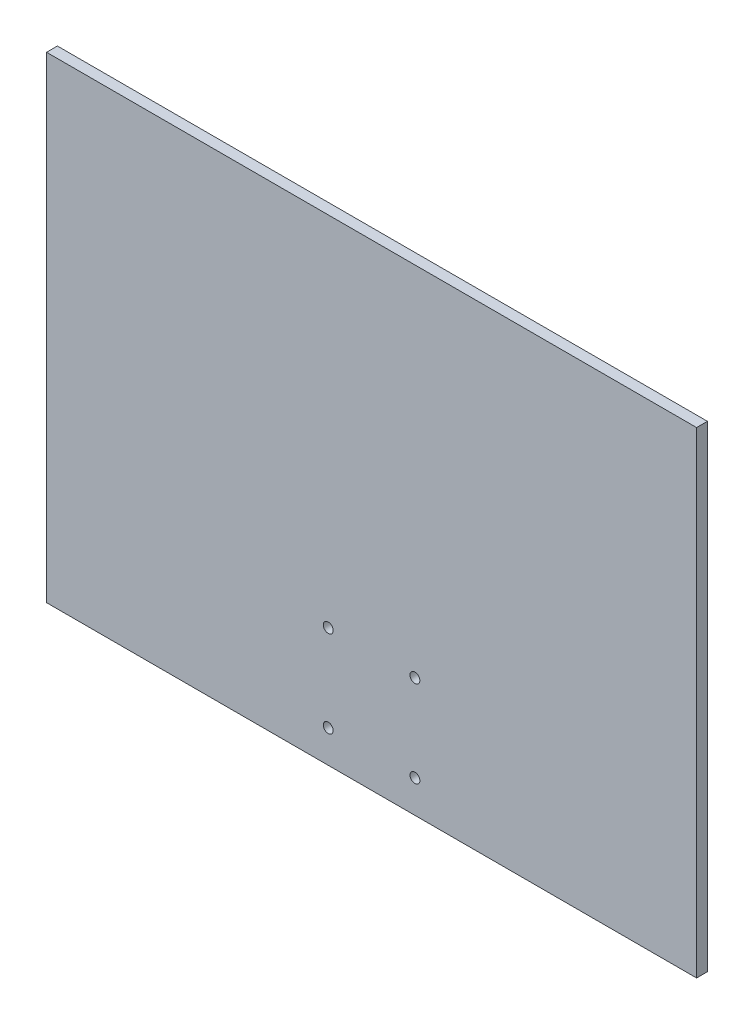
ISO-10303-21;
HEADER;
FILE_DESCRIPTION(('STEP AP214'),'2;1');
FILE_NAME('part.step','',(''),(''),'','','');
FILE_SCHEMA(('AUTOMOTIVE_DESIGN { 1 0 10303 214 1 1 1 1 }'));
ENDSEC;
DATA;
#1=APPLICATION_CONTEXT('core data for automotive mechanical design processes');
#2=APPLICATION_PROTOCOL_DEFINITION('international standard','automotive_design',2000,#1);
#3=PRODUCT_CONTEXT('',#1,'mechanical');
#4=PRODUCT('Part','Part','',(#3));
#5=PRODUCT_RELATED_PRODUCT_CATEGORY('part','',(#4));
#6=PRODUCT_DEFINITION_FORMATION('','',#4);
#7=PRODUCT_DEFINITION_CONTEXT('part definition',#1,'design');
#8=PRODUCT_DEFINITION('design','',#6,#7);
#9=PRODUCT_DEFINITION_SHAPE('','',#8);
#10=(LENGTH_UNIT() NAMED_UNIT(*) SI_UNIT(.MILLI.,.METRE.));
#11=(NAMED_UNIT(*) PLANE_ANGLE_UNIT() SI_UNIT($,.RADIAN.));
#12=(NAMED_UNIT(*) SI_UNIT($,.STERADIAN.) SOLID_ANGLE_UNIT());
#13=UNCERTAINTY_MEASURE_WITH_UNIT(LENGTH_MEASURE(1.E-05),#10,'distance_accuracy_value','');
#14=(GEOMETRIC_REPRESENTATION_CONTEXT(3) GLOBAL_UNCERTAINTY_ASSIGNED_CONTEXT((#13)) GLOBAL_UNIT_ASSIGNED_CONTEXT((#10,
#11,#12)) REPRESENTATION_CONTEXT('',''));
#15=CARTESIAN_POINT('',(0.,0.,0.));
#16=DIRECTION('',(0.,0.,1.));
#17=DIRECTION('',(1.,0.,0.));
#18=AXIS2_PLACEMENT_3D('',#15,#16,#17);
#19=CARTESIAN_POINT('',(0.,0.,0.));
#20=DIRECTION('',(0.,0.,-1.));
#21=DIRECTION('',(-1.,0.,0.));
#22=AXIS2_PLACEMENT_3D('',#19,#20,#21);
#23=PLANE('',#22);
#24=CARTESIAN_POINT('',(-25.4,-69.85,0.));
#25=DIRECTION('',(0.,0.,1.));
#26=DIRECTION('',(1.,0.,0.));
#27=AXIS2_PLACEMENT_3D('',#24,#25,#26);
#28=CIRCLE('',#27,2.9);
#29=CARTESIAN_POINT('',(-22.5,-69.85,0.));
#30=VERTEX_POINT('',#29);
#31=EDGE_CURVE('E158',#30,#30,#28,.T.);
#32=ORIENTED_EDGE('',*,*,#31,.T.);
#33=EDGE_LOOP('',(#32));
#34=FACE_BOUND('',#33,.T.);
#35=DIRECTION('',(0.,1.,0.));
#36=VECTOR('',#35,1.);
#37=CARTESIAN_POINT('',(190.5,-139.7,0.));
#38=LINE('',#37,#36);
#39=CARTESIAN_POINT('',(190.5,-139.7,0.));
#40=VERTEX_POINT('',#39);
#41=CARTESIAN_POINT('',(190.5,139.7,0.));
#42=VERTEX_POINT('',#41);
#43=EDGE_CURVE('E114',#40,#42,#38,.T.);
#44=ORIENTED_EDGE('',*,*,#43,.F.);
#45=DIRECTION('',(1.,0.,0.));
#46=VECTOR('',#45,1.);
#47=CARTESIAN_POINT('',(-190.5,-139.7,0.));
#48=LINE('',#47,#46);
#49=CARTESIAN_POINT('',(-190.5,-139.7,0.));
#50=VERTEX_POINT('',#49);
#51=EDGE_CURVE('E86',#50,#40,#48,.T.);
#52=ORIENTED_EDGE('',*,*,#51,.F.);
#53=DIRECTION('',(0.,-1.,0.));
#54=VECTOR('',#53,1.);
#55=CARTESIAN_POINT('',(-190.5,-139.7,0.));
#56=LINE('',#55,#54);
#57=CARTESIAN_POINT('',(-190.5,139.7,0.));
#58=VERTEX_POINT('',#57);
#59=EDGE_CURVE('E80',#58,#50,#56,.T.);
#60=ORIENTED_EDGE('',*,*,#59,.F.);
#61=DIRECTION('',(-1.,0.,0.));
#62=VECTOR('',#61,1.);
#63=CARTESIAN_POINT('',(-190.5,139.7,0.));
#64=LINE('',#63,#62);
#65=EDGE_CURVE('E103',#42,#58,#64,.T.);
#66=ORIENTED_EDGE('',*,*,#65,.F.);
#67=EDGE_LOOP('',(#44,#52,#60,#66));
#68=FACE_BOUND('',#67,.T.);
#69=CARTESIAN_POINT('',(-25.4,-120.65,0.));
#70=DIRECTION('',(0.,0.,1.));
#71=DIRECTION('',(1.,0.,0.));
#72=AXIS2_PLACEMENT_3D('',#69,#70,#71);
#73=CIRCLE('',#72,2.9);
#74=CARTESIAN_POINT('',(-22.5,-120.65,0.));
#75=VERTEX_POINT('',#74);
#76=EDGE_CURVE('E118',#75,#75,#73,.T.);
#77=ORIENTED_EDGE('',*,*,#76,.T.);
#78=EDGE_LOOP('',(#77));
#79=FACE_BOUND('',#78,.T.);
#80=CARTESIAN_POINT('',(25.4,-69.85,0.));
#81=DIRECTION('',(0.,0.,1.));
#82=DIRECTION('',(1.,0.,0.));
#83=AXIS2_PLACEMENT_3D('',#80,#81,#82);
#84=CIRCLE('',#83,2.9);
#85=CARTESIAN_POINT('',(28.3,-69.85,0.));
#86=VERTEX_POINT('',#85);
#87=EDGE_CURVE('E142',#86,#86,#84,.T.);
#88=ORIENTED_EDGE('',*,*,#87,.T.);
#89=EDGE_LOOP('',(#88));
#90=FACE_BOUND('',#89,.T.);
#91=CARTESIAN_POINT('',(25.4,-120.65,0.));
#92=DIRECTION('',(0.,0.,1.));
#93=DIRECTION('',(1.,0.,0.));
#94=AXIS2_PLACEMENT_3D('',#91,#92,#93);
#95=CIRCLE('',#94,2.9);
#96=CARTESIAN_POINT('',(28.3,-120.65,0.));
#97=VERTEX_POINT('',#96);
#98=EDGE_CURVE('E150',#97,#97,#95,.T.);
#99=ORIENTED_EDGE('',*,*,#98,.T.);
#100=EDGE_LOOP('',(#99));
#101=FACE_BOUND('',#100,.T.);
#102=ADVANCED_FACE('F45',(#34,#68,#79,#90,#101),#23,.T.);
#103=CARTESIAN_POINT('',(190.5,-139.7,6.35));
#104=DIRECTION('',(-1.,0.,0.));
#105=DIRECTION('',(0.,0.,1.));
#106=AXIS2_PLACEMENT_3D('',#103,#104,#105);
#107=PLANE('',#106);
#108=ORIENTED_EDGE('',*,*,#43,.T.);
#109=DIRECTION('',(0.,0.,-1.));
#110=VECTOR('',#109,1.);
#111=CARTESIAN_POINT('',(190.5,139.7,6.35));
#112=LINE('',#111,#110);
#113=CARTESIAN_POINT('',(190.5,139.7,6.35));
#114=VERTEX_POINT('',#113);
#115=EDGE_CURVE('E11',#114,#42,#112,.T.);
#116=ORIENTED_EDGE('',*,*,#115,.F.);
#117=DIRECTION('',(0.,1.,0.));
#118=VECTOR('',#117,1.);
#119=CARTESIAN_POINT('',(190.5,-139.7,6.35));
#120=LINE('',#119,#118);
#121=CARTESIAN_POINT('',(190.5,-139.7,6.35));
#122=VERTEX_POINT('',#121);
#123=EDGE_CURVE('E98',#122,#114,#120,.T.);
#124=ORIENTED_EDGE('',*,*,#123,.F.);
#125=DIRECTION('',(0.,0.,-1.));
#126=VECTOR('',#125,1.);
#127=CARTESIAN_POINT('',(190.5,-139.7,6.35));
#128=LINE('',#127,#126);
#129=EDGE_CURVE('E110',#122,#40,#128,.T.);
#130=ORIENTED_EDGE('',*,*,#129,.T.);
#131=EDGE_LOOP('',(#108,#116,#124,#130));
#132=FACE_BOUND('',#131,.T.);
#133=ADVANCED_FACE('F47',(#132),#107,.F.);
#134=CARTESIAN_POINT('',(-190.5,139.7,6.35));
#135=DIRECTION('',(0.,-1.,0.));
#136=DIRECTION('',(0.,0.,-1.));
#137=AXIS2_PLACEMENT_3D('',#134,#135,#136);
#138=PLANE('',#137);
#139=ORIENTED_EDGE('',*,*,#65,.T.);
#140=DIRECTION('',(0.,0.,-1.));
#141=VECTOR('',#140,1.);
#142=CARTESIAN_POINT('',(-190.5,139.7,6.35));
#143=LINE('',#142,#141);
#144=CARTESIAN_POINT('',(-190.5,139.7,6.35));
#145=VERTEX_POINT('',#144);
#146=EDGE_CURVE('E55',#145,#58,#143,.T.);
#147=ORIENTED_EDGE('',*,*,#146,.F.);
#148=DIRECTION('',(-1.,0.,0.));
#149=VECTOR('',#148,1.);
#150=CARTESIAN_POINT('',(-190.5,139.7,6.35));
#151=LINE('',#150,#149);
#152=EDGE_CURVE('E93',#114,#145,#151,.T.);
#153=ORIENTED_EDGE('',*,*,#152,.F.);
#154=ORIENTED_EDGE('',*,*,#115,.T.);
#155=EDGE_LOOP('',(#139,#147,#153,#154));
#156=FACE_BOUND('',#155,.T.);
#157=ADVANCED_FACE('F102',(#156),#138,.F.);
#158=CARTESIAN_POINT('',(-190.5,-139.7,6.35));
#159=DIRECTION('',(1.,0.,0.));
#160=DIRECTION('',(0.,0.,-1.));
#161=AXIS2_PLACEMENT_3D('',#158,#159,#160);
#162=PLANE('',#161);
#163=ORIENTED_EDGE('',*,*,#59,.T.);
#164=DIRECTION('',(0.,0.,-1.));
#165=VECTOR('',#164,1.);
#166=CARTESIAN_POINT('',(-190.5,-139.7,6.35));
#167=LINE('',#166,#165);
#168=CARTESIAN_POINT('',(-190.5,-139.7,6.35));
#169=VERTEX_POINT('',#168);
#170=EDGE_CURVE('E105',#169,#50,#167,.T.);
#171=ORIENTED_EDGE('',*,*,#170,.F.);
#172=DIRECTION('',(0.,-1.,0.));
#173=VECTOR('',#172,1.);
#174=CARTESIAN_POINT('',(-190.5,-139.7,6.35));
#175=LINE('',#174,#173);
#176=EDGE_CURVE('E96',#145,#169,#175,.T.);
#177=ORIENTED_EDGE('',*,*,#176,.F.);
#178=ORIENTED_EDGE('',*,*,#146,.T.);
#179=EDGE_LOOP('',(#163,#171,#177,#178));
#180=FACE_BOUND('',#179,.T.);
#181=ADVANCED_FACE('F106',(#180),#162,.F.);
#182=CARTESIAN_POINT('',(-190.5,-139.7,6.35));
#183=DIRECTION('',(0.,1.,0.));
#184=DIRECTION('',(0.,0.,1.));
#185=AXIS2_PLACEMENT_3D('',#182,#183,#184);
#186=PLANE('',#185);
#187=ORIENTED_EDGE('',*,*,#51,.T.);
#188=ORIENTED_EDGE('',*,*,#129,.F.);
#189=DIRECTION('',(1.,0.,0.));
#190=VECTOR('',#189,1.);
#191=CARTESIAN_POINT('',(-190.5,-139.7,6.35));
#192=LINE('',#191,#190);
#193=EDGE_CURVE('E63',#169,#122,#192,.T.);
#194=ORIENTED_EDGE('',*,*,#193,.F.);
#195=ORIENTED_EDGE('',*,*,#170,.T.);
#196=EDGE_LOOP('',(#187,#188,#194,#195));
#197=FACE_BOUND('',#196,.T.);
#198=ADVANCED_FACE('F128',(#197),#186,.F.);
#199=CARTESIAN_POINT('',(0.,0.,6.35));
#200=DIRECTION('',(0.,0.,-1.));
#201=DIRECTION('',(-1.,0.,0.));
#202=AXIS2_PLACEMENT_3D('',#199,#200,#201);
#203=PLANE('',#202);
#204=CARTESIAN_POINT('',(-25.4,-69.85,6.35));
#205=DIRECTION('',(0.,0.,1.));
#206=DIRECTION('',(1.,0.,0.));
#207=AXIS2_PLACEMENT_3D('',#204,#205,#206);
#208=CIRCLE('',#207,2.9);
#209=CARTESIAN_POINT('',(-22.5,-69.85,6.35));
#210=VERTEX_POINT('',#209);
#211=EDGE_CURVE('E162',#210,#210,#208,.T.);
#212=ORIENTED_EDGE('',*,*,#211,.F.);
#213=EDGE_LOOP('',(#212));
#214=FACE_BOUND('',#213,.T.);
#215=CARTESIAN_POINT('',(25.4,-120.65,6.35));
#216=DIRECTION('',(0.,0.,1.));
#217=DIRECTION('',(1.,0.,0.));
#218=AXIS2_PLACEMENT_3D('',#215,#216,#217);
#219=CIRCLE('',#218,2.9);
#220=CARTESIAN_POINT('',(28.3,-120.65,6.35));
#221=VERTEX_POINT('',#220);
#222=EDGE_CURVE('E154',#221,#221,#219,.T.);
#223=ORIENTED_EDGE('',*,*,#222,.F.);
#224=EDGE_LOOP('',(#223));
#225=FACE_BOUND('',#224,.T.);
#226=CARTESIAN_POINT('',(25.4,-69.85,6.35));
#227=DIRECTION('',(0.,0.,1.));
#228=DIRECTION('',(1.,0.,0.));
#229=AXIS2_PLACEMENT_3D('',#226,#227,#228);
#230=CIRCLE('',#229,2.9);
#231=CARTESIAN_POINT('',(28.3,-69.85,6.35));
#232=VERTEX_POINT('',#231);
#233=EDGE_CURVE('E146',#232,#232,#230,.T.);
#234=ORIENTED_EDGE('',*,*,#233,.F.);
#235=EDGE_LOOP('',(#234));
#236=FACE_BOUND('',#235,.T.);
#237=CARTESIAN_POINT('',(-25.4,-120.65,6.35));
#238=DIRECTION('',(0.,0.,1.));
#239=DIRECTION('',(1.,0.,0.));
#240=AXIS2_PLACEMENT_3D('',#237,#238,#239);
#241=CIRCLE('',#240,2.9);
#242=CARTESIAN_POINT('',(-22.5,-120.65,6.35));
#243=VERTEX_POINT('',#242);
#244=EDGE_CURVE('E138',#243,#243,#241,.T.);
#245=ORIENTED_EDGE('',*,*,#244,.F.);
#246=EDGE_LOOP('',(#245));
#247=FACE_BOUND('',#246,.T.);
#248=ORIENTED_EDGE('',*,*,#123,.T.);
#249=ORIENTED_EDGE('',*,*,#152,.T.);
#250=ORIENTED_EDGE('',*,*,#176,.T.);
#251=ORIENTED_EDGE('',*,*,#193,.T.);
#252=EDGE_LOOP('',(#248,#249,#250,#251));
#253=FACE_BOUND('',#252,.T.);
#254=ADVANCED_FACE('F94',(#214,#225,#236,#247,#253),#203,.F.);
#255=CARTESIAN_POINT('',(-25.4,-120.65,6.35));
#256=DIRECTION('',(0.,0.,1.));
#257=DIRECTION('',(1.,0.,0.));
#258=AXIS2_PLACEMENT_3D('',#255,#256,#257);
#259=CYLINDRICAL_SURFACE('',#258,2.9);
#260=ORIENTED_EDGE('',*,*,#76,.F.);
#261=EDGE_LOOP('',(#260));
#262=FACE_BOUND('',#261,.T.);
#263=ORIENTED_EDGE('',*,*,#244,.T.);
#264=EDGE_LOOP('',(#263));
#265=FACE_BOUND('',#264,.T.);
#266=ADVANCED_FACE('F171',(#262,#265),#259,.F.);
#267=CARTESIAN_POINT('',(25.4,-69.85,6.35));
#268=DIRECTION('',(0.,0.,1.));
#269=DIRECTION('',(1.,0.,0.));
#270=AXIS2_PLACEMENT_3D('',#267,#268,#269);
#271=CYLINDRICAL_SURFACE('',#270,2.9);
#272=ORIENTED_EDGE('',*,*,#87,.F.);
#273=EDGE_LOOP('',(#272));
#274=FACE_BOUND('',#273,.T.);
#275=ORIENTED_EDGE('',*,*,#233,.T.);
#276=EDGE_LOOP('',(#275));
#277=FACE_BOUND('',#276,.T.);
#278=ADVANCED_FACE('F180',(#274,#277),#271,.F.);
#279=CARTESIAN_POINT('',(25.4,-120.65,6.35));
#280=DIRECTION('',(0.,0.,1.));
#281=DIRECTION('',(1.,0.,0.));
#282=AXIS2_PLACEMENT_3D('',#279,#280,#281);
#283=CYLINDRICAL_SURFACE('',#282,2.9);
#284=ORIENTED_EDGE('',*,*,#98,.F.);
#285=EDGE_LOOP('',(#284));
#286=FACE_BOUND('',#285,.T.);
#287=ORIENTED_EDGE('',*,*,#222,.T.);
#288=EDGE_LOOP('',(#287));
#289=FACE_BOUND('',#288,.T.);
#290=ADVANCED_FACE('F186',(#286,#289),#283,.F.);
#291=CARTESIAN_POINT('',(-25.4,-69.85,6.35));
#292=DIRECTION('',(0.,0.,1.));
#293=DIRECTION('',(1.,0.,0.));
#294=AXIS2_PLACEMENT_3D('',#291,#292,#293);
#295=CYLINDRICAL_SURFACE('',#294,2.9);
#296=ORIENTED_EDGE('',*,*,#31,.F.);
#297=EDGE_LOOP('',(#296));
#298=FACE_BOUND('',#297,.T.);
#299=ORIENTED_EDGE('',*,*,#211,.T.);
#300=EDGE_LOOP('',(#299));
#301=FACE_BOUND('',#300,.T.);
#302=ADVANCED_FACE('F167',(#298,#301),#295,.F.);
#303=CLOSED_SHELL('',(#102,#133,#157,#181,#198,#254,#266,#278,#290,#302));
#304=MANIFOLD_SOLID_BREP('B2',#303);
#305=ADVANCED_BREP_SHAPE_REPRESENTATION('',(#18,#304),#14);
#306=SHAPE_DEFINITION_REPRESENTATION(#9,#305);
ENDSEC;
END-ISO-10303-21;
